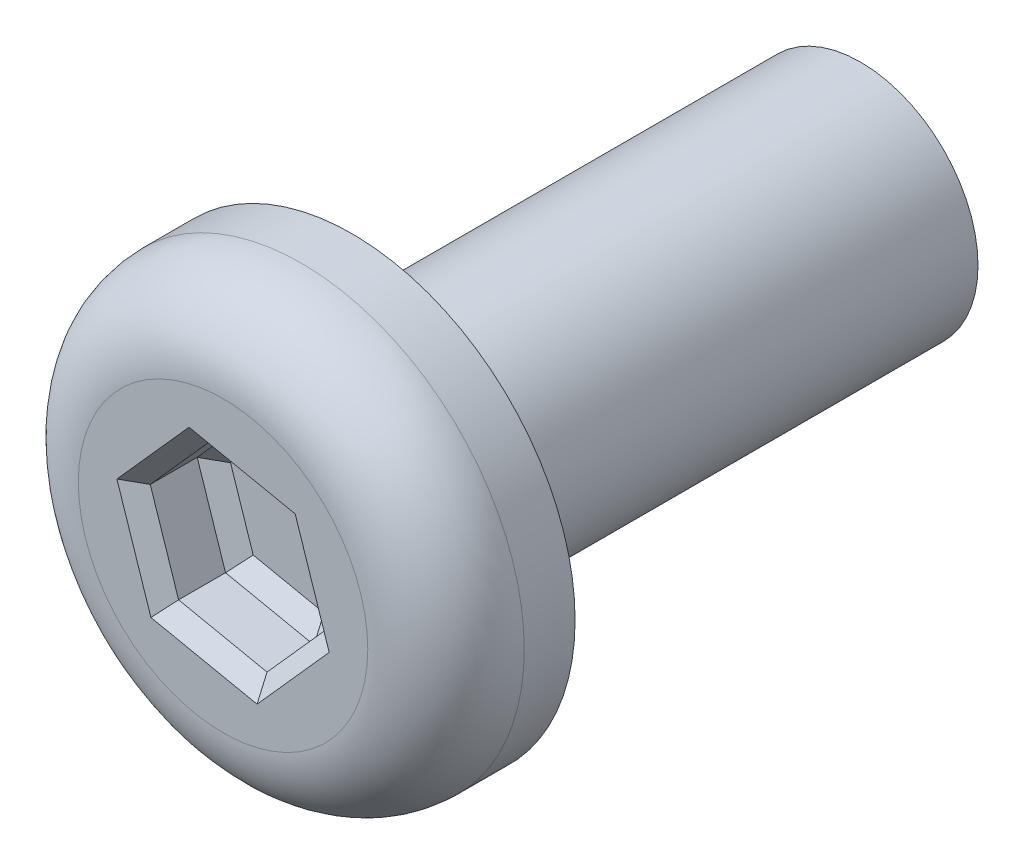
ISO-10303-21;
HEADER;
FILE_DESCRIPTION(('STEP AP214'),'2;1');
FILE_NAME('part.step','',(''),(''),'','','');
FILE_SCHEMA(('AUTOMOTIVE_DESIGN { 1 0 10303 214 1 1 1 1 }'));
ENDSEC;
DATA;
#1=APPLICATION_CONTEXT('core data for automotive mechanical design processes');
#2=APPLICATION_PROTOCOL_DEFINITION('international standard','automotive_design',2000,#1);
#3=PRODUCT_CONTEXT('',#1,'mechanical');
#4=PRODUCT('Part','Part','',(#3));
#5=PRODUCT_RELATED_PRODUCT_CATEGORY('part','',(#4));
#6=PRODUCT_DEFINITION_FORMATION('','',#4);
#7=PRODUCT_DEFINITION_CONTEXT('part definition',#1,'design');
#8=PRODUCT_DEFINITION('design','',#6,#7);
#9=PRODUCT_DEFINITION_SHAPE('','',#8);
#10=(LENGTH_UNIT() NAMED_UNIT(*) SI_UNIT(.MILLI.,.METRE.));
#11=(NAMED_UNIT(*) PLANE_ANGLE_UNIT() SI_UNIT($,.RADIAN.));
#12=(NAMED_UNIT(*) SI_UNIT($,.STERADIAN.) SOLID_ANGLE_UNIT());
#13=UNCERTAINTY_MEASURE_WITH_UNIT(LENGTH_MEASURE(1.E-05),#10,'distance_accuracy_value','');
#14=(GEOMETRIC_REPRESENTATION_CONTEXT(3) GLOBAL_UNCERTAINTY_ASSIGNED_CONTEXT((#13)) GLOBAL_UNIT_ASSIGNED_CONTEXT((#10,
#11,#12)) REPRESENTATION_CONTEXT('',''));
#15=CARTESIAN_POINT('',(0.,0.,0.));
#16=DIRECTION('',(0.,0.,1.));
#17=DIRECTION('',(1.,0.,0.));
#18=AXIS2_PLACEMENT_3D('',#15,#16,#17);
#19=CARTESIAN_POINT('',(0.,0.,1.65));
#20=DIRECTION('',(0.,0.,-1.));
#21=DIRECTION('',(-1.,0.,0.));
#22=AXIS2_PLACEMENT_3D('',#19,#20,#21);
#23=CYLINDRICAL_SURFACE('',#22,2.85);
#24=CARTESIAN_POINT('',(0.,0.,0.65));
#25=DIRECTION('',(0.,0.,1.));
#26=DIRECTION('',(1.,0.,0.));
#27=AXIS2_PLACEMENT_3D('',#24,#25,#26);
#28=CIRCLE('',#27,2.85);
#29=CARTESIAN_POINT('',(2.85,0.,0.65));
#30=VERTEX_POINT('',#29);
#31=EDGE_CURVE('E162',#30,#30,#28,.F.);
#32=ORIENTED_EDGE('',*,*,#31,.T.);
#33=EDGE_LOOP('',(#32));
#34=FACE_BOUND('',#33,.T.);
#35=CARTESIAN_POINT('',(0.,0.,0.));
#36=DIRECTION('',(0.,0.,1.));
#37=DIRECTION('',(1.,0.,0.));
#38=AXIS2_PLACEMENT_3D('',#35,#36,#37);
#39=CIRCLE('',#38,2.85);
#40=CARTESIAN_POINT('',(2.85,0.,0.));
#41=VERTEX_POINT('',#40);
#42=EDGE_CURVE('E255',#41,#41,#39,.T.);
#43=ORIENTED_EDGE('',*,*,#42,.T.);
#44=EDGE_LOOP('',(#43));
#45=FACE_BOUND('',#44,.T.);
#46=ADVANCED_FACE('F36',(#34,#45),#23,.T.);
#47=CARTESIAN_POINT('',(0.,0.,1.65));
#48=DIRECTION('',(0.,0.,1.));
#49=DIRECTION('',(1.,0.,0.));
#50=AXIS2_PLACEMENT_3D('',#47,#48,#49);
#51=PLANE('',#50);
#52=DIRECTION('',(0.313693749060299,-0.949524213382942,0.));
#53=VECTOR('',#52,1.);
#54=CARTESIAN_POINT('',(1.3205402265226,-0.17177556132635,1.65));
#55=LINE('',#54,#53);
#56=CARTESIAN_POINT('',(0.922095651503852,1.03428217111081,1.65));
#57=VERTEX_POINT('',#56);
#58=CARTESIAN_POINT('',(1.35676246061521,-0.281417173366094,1.65));
#59=VERTEX_POINT('',#58);
#60=EDGE_CURVE('E178',#57,#59,#55,.T.);
#61=ORIENTED_EDGE('',*,*,#60,.T.);
#62=DIRECTION('',(-0.665465215767914,-0.74642886238607,0.));
#63=VECTOR('',#62,1.);
#64=CARTESIAN_POINT('',(0.511508113403348,-1.229509163551,1.65));
#65=LINE('',#64,#63);
#66=CARTESIAN_POINT('',(0.43466680911136,-1.31569934447691,1.65));
#67=VERTEX_POINT('',#66);
#68=EDGE_CURVE('E137',#59,#67,#65,.T.);
#69=ORIENTED_EDGE('',*,*,#68,.T.);
#70=DIRECTION('',(-0.979158964828213,0.203095350996872,0.));
#71=VECTOR('',#70,1.);
#72=CARTESIAN_POINT('',(-0.809032113119251,-1.05773360222465,1.65));
#73=LINE('',#72,#71);
#74=CARTESIAN_POINT('',(-0.922095651503853,-1.03428217111081,1.65));
#75=VERTEX_POINT('',#74);
#76=EDGE_CURVE('E164',#67,#75,#73,.T.);
#77=ORIENTED_EDGE('',*,*,#76,.T.);
#78=DIRECTION('',(-0.313693749060299,0.949524213382942,0.));
#79=VECTOR('',#78,1.);
#80=CARTESIAN_POINT('',(-1.3205402265226,0.17177556132635,1.65));
#81=LINE('',#80,#79);
#82=CARTESIAN_POINT('',(-1.35676246061521,0.281417173366094,1.65));
#83=VERTEX_POINT('',#82);
#84=EDGE_CURVE('E172',#75,#83,#81,.T.);
#85=ORIENTED_EDGE('',*,*,#84,.T.);
#86=DIRECTION('',(0.665465215767914,0.74642886238607,0.));
#87=VECTOR('',#86,1.);
#88=CARTESIAN_POINT('',(-0.511508113403349,1.229509163551,1.65));
#89=LINE('',#88,#87);
#90=CARTESIAN_POINT('',(-0.43466680911136,1.31569934447691,1.65));
#91=VERTEX_POINT('',#90);
#92=EDGE_CURVE('E174',#83,#91,#89,.T.);
#93=ORIENTED_EDGE('',*,*,#92,.T.);
#94=DIRECTION('',(0.979158964828213,-0.203095350996872,0.));
#95=VECTOR('',#94,1.);
#96=CARTESIAN_POINT('',(0.80903211311925,1.05773360222465,1.65));
#97=LINE('',#96,#95);
#98=EDGE_CURVE('E176',#91,#57,#97,.T.);
#99=ORIENTED_EDGE('',*,*,#98,.T.);
#100=EDGE_LOOP('',(#61,#69,#77,#85,#93,#99));
#101=FACE_BOUND('',#100,.T.);
#102=CARTESIAN_POINT('',(0.,0.,1.65));
#103=DIRECTION('',(0.,0.,1.));
#104=DIRECTION('',(1.,0.,0.));
#105=AXIS2_PLACEMENT_3D('',#102,#103,#104);
#106=CIRCLE('',#105,1.85);
#107=CARTESIAN_POINT('',(1.85,0.,1.65));
#108=VERTEX_POINT('',#107);
#109=EDGE_CURVE('E167',#108,#108,#106,.T.);
#110=ORIENTED_EDGE('',*,*,#109,.T.);
#111=EDGE_LOOP('',(#110));
#112=FACE_BOUND('',#111,.T.);
#113=ADVANCED_FACE('F263',(#101,#112),#51,.T.);
#114=CARTESIAN_POINT('',(0.,0.,0.));
#115=DIRECTION('',(0.,0.,1.));
#116=DIRECTION('',(1.,0.,0.));
#117=AXIS2_PLACEMENT_3D('',#114,#115,#116);
#118=PLANE('',#117);
#119=CARTESIAN_POINT('',(0.,0.,0.));
#120=DIRECTION('',(0.,0.,-1.));
#121=DIRECTION('',(-1.,0.,0.));
#122=AXIS2_PLACEMENT_3D('',#119,#120,#121);
#123=CIRCLE('',#122,1.5);
#124=CARTESIAN_POINT('',(1.5,0.,0.));
#125=VERTEX_POINT('',#124);
#126=EDGE_CURVE('E256',#125,#125,#123,.T.);
#127=ORIENTED_EDGE('',*,*,#126,.F.);
#128=EDGE_LOOP('',(#127));
#129=FACE_BOUND('',#128,.T.);
#130=ORIENTED_EDGE('',*,*,#42,.F.);
#131=EDGE_LOOP('',(#130));
#132=FACE_BOUND('',#131,.T.);
#133=ADVANCED_FACE('F289',(#129,#132),#118,.F.);
#134=CARTESIAN_POINT('',(0.,0.,-6.5));
#135=DIRECTION('',(0.,0.,1.));
#136=DIRECTION('',(1.,0.,0.));
#137=AXIS2_PLACEMENT_3D('',#134,#135,#136);
#138=CYLINDRICAL_SURFACE('',#137,1.5);
#139=CARTESIAN_POINT('',(0.,0.,-6.5));
#140=DIRECTION('',(0.,0.,-1.));
#141=DIRECTION('',(-1.,0.,0.));
#142=AXIS2_PLACEMENT_3D('',#139,#140,#141);
#143=CIRCLE('',#142,1.5);
#144=CARTESIAN_POINT('',(1.5,0.,-6.5));
#145=VERTEX_POINT('',#144);
#146=EDGE_CURVE('E252',#145,#145,#143,.T.);
#147=CARTESIAN_POINT('',(1.5,0.,-6.5));
#148=CARTESIAN_POINT('',(1.5,0.,-6.43229166666667));
#149=CARTESIAN_POINT('',(1.5,0.,-6.36458333333333));
#150=CARTESIAN_POINT('',(1.5,0.,-6.22916666666667));
#151=CARTESIAN_POINT('',(1.5,0.,-6.16145833333333));
#152=CARTESIAN_POINT('',(1.5,0.,-6.02604166666667));
#153=CARTESIAN_POINT('',(1.5,0.,-5.95833333333333));
#154=CARTESIAN_POINT('',(1.5,0.,-5.82291666666667));
#155=CARTESIAN_POINT('',(1.5,0.,-5.75520833333333));
#156=CARTESIAN_POINT('',(1.5,0.,-5.61979166666667));
#157=CARTESIAN_POINT('',(1.5,0.,-5.55208333333333));
#158=CARTESIAN_POINT('',(1.5,0.,-5.41666666666667));
#159=CARTESIAN_POINT('',(1.5,0.,-5.34895833333333));
#160=CARTESIAN_POINT('',(1.5,0.,-5.21354166666667));
#161=CARTESIAN_POINT('',(1.5,0.,-5.14583333333333));
#162=CARTESIAN_POINT('',(1.5,0.,-5.01041666666667));
#163=CARTESIAN_POINT('',(1.5,0.,-4.94270833333333));
#164=CARTESIAN_POINT('',(1.5,0.,-4.80729166666667));
#165=CARTESIAN_POINT('',(1.5,0.,-4.73958333333333));
#166=CARTESIAN_POINT('',(1.5,0.,-4.60416666666667));
#167=CARTESIAN_POINT('',(1.5,0.,-4.53645833333333));
#168=CARTESIAN_POINT('',(1.5,0.,-4.40104166666667));
#169=CARTESIAN_POINT('',(1.5,0.,-4.33333333333333));
#170=CARTESIAN_POINT('',(1.5,0.,-4.19791666666667));
#171=CARTESIAN_POINT('',(1.5,0.,-4.13020833333333));
#172=CARTESIAN_POINT('',(1.5,0.,-3.99479166666667));
#173=CARTESIAN_POINT('',(1.5,0.,-3.92708333333333));
#174=CARTESIAN_POINT('',(1.5,0.,-3.79166666666667));
#175=CARTESIAN_POINT('',(1.5,0.,-3.72395833333333));
#176=CARTESIAN_POINT('',(1.5,0.,-3.58854166666667));
#177=CARTESIAN_POINT('',(1.5,0.,-3.52083333333333));
#178=CARTESIAN_POINT('',(1.5,0.,-3.38541666666667));
#179=CARTESIAN_POINT('',(1.5,0.,-3.31770833333333));
#180=CARTESIAN_POINT('',(1.5,0.,-3.18229166666667));
#181=CARTESIAN_POINT('',(1.5,0.,-3.11458333333333));
#182=CARTESIAN_POINT('',(1.5,0.,-2.97916666666667));
#183=CARTESIAN_POINT('',(1.5,0.,-2.91145833333333));
#184=CARTESIAN_POINT('',(1.5,0.,-2.77604166666667));
#185=CARTESIAN_POINT('',(1.5,0.,-2.70833333333333));
#186=CARTESIAN_POINT('',(1.5,0.,-2.57291666666667));
#187=CARTESIAN_POINT('',(1.5,0.,-2.50520833333333));
#188=CARTESIAN_POINT('',(1.5,0.,-2.36979166666667));
#189=CARTESIAN_POINT('',(1.5,0.,-2.30208333333333));
#190=CARTESIAN_POINT('',(1.5,0.,-2.16666666666667));
#191=CARTESIAN_POINT('',(1.5,0.,-2.09895833333333));
#192=CARTESIAN_POINT('',(1.5,0.,-1.96354166666667));
#193=CARTESIAN_POINT('',(1.5,0.,-1.89583333333333));
#194=CARTESIAN_POINT('',(1.5,0.,-1.76041666666667));
#195=CARTESIAN_POINT('',(1.5,0.,-1.69270833333333));
#196=CARTESIAN_POINT('',(1.5,0.,-1.55729166666667));
#197=CARTESIAN_POINT('',(1.5,0.,-1.48958333333333));
#198=CARTESIAN_POINT('',(1.5,0.,-1.35416666666667));
#199=CARTESIAN_POINT('',(1.5,0.,-1.28645833333333));
#200=CARTESIAN_POINT('',(1.5,0.,-1.15104166666667));
#201=CARTESIAN_POINT('',(1.5,0.,-1.08333333333333));
#202=CARTESIAN_POINT('',(1.5,0.,-0.947916666666667));
#203=CARTESIAN_POINT('',(1.5,0.,-0.880208333333333));
#204=CARTESIAN_POINT('',(1.5,0.,-0.744791666666667));
#205=CARTESIAN_POINT('',(1.5,0.,-0.677083333333333));
#206=CARTESIAN_POINT('',(1.5,0.,-0.541666666666667));
#207=CARTESIAN_POINT('',(1.5,0.,-0.473958333333333));
#208=CARTESIAN_POINT('',(1.5,0.,-0.338541666666667));
#209=CARTESIAN_POINT('',(1.5,0.,-0.270833333333334));
#210=CARTESIAN_POINT('',(1.5,0.,-0.135416666666667));
#211=CARTESIAN_POINT('',(1.5,0.,-0.0677083333333334));
#212=CARTESIAN_POINT('',(1.5,0.,0.));
#213=B_SPLINE_CURVE_WITH_KNOTS('',3,(#147,#148,#149,#150,#151,#152,#153,#154,#155,#156,#157,
#158,#159,#160,#161,#162,#163,#164,#165,#166,#167,#168,#169,#170,#171,#172,#173,#174,#175,#176,
#177,#178,#179,#180,#181,#182,#183,#184,#185,#186,#187,#188,#189,#190,#191,#192,#193,#194,#195,
#196,#197,#198,#199,#200,#201,#202,#203,#204,#205,#206,#207,#208,#209,#210,#211,#212),
.UNSPECIFIED.,.F.,.F.,(4,2,2,2,2,2,2,2,2,2,2,2,2,2,2,2,2,2,2,2,2,2,2,2,2,2,2,2,2,2,2,2,4),(0.,
0.203124999999999,0.40625,0.609375,0.812499999999999,1.015625,1.21875,1.421875,1.625,1.828125,
2.03125,2.234375,2.4375,2.640625,2.84375,3.046875,3.25,3.453125,3.65625,3.859375,4.0625,
4.265625,4.46875,4.671875,4.875,5.078125,5.28125,5.484375,5.6875,5.890625,6.09375,6.296875,6.5),.UNSPECIFIED.);
#214=EDGE_CURVE('BSEAM278',#145,#125,#213,.T.);
#215=ORIENTED_EDGE('',*,*,#146,.F.);
#216=ORIENTED_EDGE('',*,*,#126,.T.);
#217=ORIENTED_EDGE('',*,*,#214,.T.);
#218=ORIENTED_EDGE('',*,*,#214,.F.);
#219=EDGE_LOOP('',(#215,#217,#216,#218));
#220=FACE_BOUND('',#219,.T.);
#221=ADVANCED_FACE('F278',(#220),#138,.T.);
#222=CARTESIAN_POINT('',(0.,0.,-6.5));
#223=DIRECTION('',(0.,0.,-1.));
#224=DIRECTION('',(-1.,0.,0.));
#225=AXIS2_PLACEMENT_3D('',#222,#223,#224);
#226=PLANE('',#225);
#227=ORIENTED_EDGE('',*,*,#146,.T.);
#228=EDGE_LOOP('',(#227));
#229=FACE_BOUND('',#228,.T.);
#230=ADVANCED_FACE('F268',(#229),#226,.T.);
#231=CARTESIAN_POINT('',(0.,0.,0.65));
#232=DIRECTION('',(0.,0.,1.));
#233=DIRECTION('',(1.,0.,0.));
#234=AXIS2_PLACEMENT_3D('',#231,#232,#233);
#235=TOROIDAL_SURFACE('',#234,1.85,1.);
#236=ORIENTED_EDGE('',*,*,#31,.F.);
#237=EDGE_LOOP('',(#236));
#238=FACE_BOUND('',#237,.T.);
#239=ORIENTED_EDGE('',*,*,#109,.F.);
#240=EDGE_LOOP('',(#239));
#241=FACE_BOUND('',#240,.T.);
#242=ADVANCED_FACE('F265',(#238,#241),#235,.T.);
#243=CARTESIAN_POINT('',(-0.768413042919876,-0.861901809259008,0.65));
#244=DIRECTION('',(-0.203095350996872,-0.979158964828213,0.));
#245=DIRECTION('',(0.979158964828213,-0.203095350996872,0.));
#246=AXIS2_PLACEMENT_3D('',#243,#244,#245);
#247=PLANE('',#246);
#248=DIRECTION('',(0.,0.,1.));
#249=VECTOR('',#248,1.);
#250=CARTESIAN_POINT('',(-0.768413042919876,-0.861901809259008,0.65));
#251=LINE('',#250,#249);
#252=CARTESIAN_POINT('',(-0.768413042919876,-0.861901809259008,0.849999999999997));
#253=VERTEX_POINT('',#252);
#254=CARTESIAN_POINT('',(-0.768413042919876,-0.861901809259008,1.45));
#255=VERTEX_POINT('',#254);
#256=EDGE_CURVE('E246',#253,#255,#251,.T.);
#257=ORIENTED_EDGE('',*,*,#256,.T.);
#258=DIRECTION('',(0.979158964828213,-0.203095350996872,0.));
#259=VECTOR('',#258,1.);
#260=CARTESIAN_POINT('',(0.362222340926133,-1.09641612039742,1.45));
#261=LINE('',#260,#259);
#262=CARTESIAN_POINT('',(0.362222340926132,-1.09641612039742,1.45));
#263=VERTEX_POINT('',#262);
#264=EDGE_CURVE('E198',#255,#263,#261,.T.);
#265=ORIENTED_EDGE('',*,*,#264,.T.);
#266=DIRECTION('',(0.,0.,1.));
#267=VECTOR('',#266,1.);
#268=CARTESIAN_POINT('',(0.362222340926132,-1.09641612039742,0.65));
#269=LINE('',#268,#267);
#270=CARTESIAN_POINT('',(0.362222340926132,-1.09641612039742,0.849999999999997));
#271=VERTEX_POINT('',#270);
#272=EDGE_CURVE('E148',#271,#263,#269,.T.);
#273=ORIENTED_EDGE('',*,*,#272,.F.);
#274=DIRECTION('',(-0.979158964828213,0.203095350996872,0.));
#275=VECTOR('',#274,1.);
#276=CARTESIAN_POINT('',(-0.768413042919876,-0.861901809259008,0.849999999999997));
#277=LINE('',#276,#275);
#278=EDGE_CURVE('E196',#271,#253,#277,.T.);
#279=ORIENTED_EDGE('',*,*,#278,.T.);
#280=EDGE_LOOP('',(#257,#265,#273,#279));
#281=FACE_BOUND('',#280,.T.);
#282=ADVANCED_FACE('F267',(#281),#247,.F.);
#283=CARTESIAN_POINT('',(-1.13063538384601,0.234514311138411,0.65));
#284=DIRECTION('',(-0.949524213382942,-0.313693749060299,0.));
#285=DIRECTION('',(0.313693749060299,-0.949524213382942,0.));
#286=AXIS2_PLACEMENT_3D('',#283,#284,#285);
#287=PLANE('',#286);
#288=DIRECTION('',(0.,0.,1.));
#289=VECTOR('',#288,1.);
#290=CARTESIAN_POINT('',(-1.13063538384601,0.234514311138411,0.65));
#291=LINE('',#290,#289);
#292=CARTESIAN_POINT('',(-1.13063538384601,0.234514311138411,0.849999999999997));
#293=VERTEX_POINT('',#292);
#294=CARTESIAN_POINT('',(-1.13063538384601,0.234514311138411,1.45));
#295=VERTEX_POINT('',#294);
#296=EDGE_CURVE('E243',#293,#295,#291,.T.);
#297=ORIENTED_EDGE('',*,*,#296,.T.);
#298=DIRECTION('',(0.313693749060299,-0.949524213382942,0.));
#299=VECTOR('',#298,1.);
#300=CARTESIAN_POINT('',(-0.768413042919876,-0.861901809259008,1.45));
#301=LINE('',#300,#299);
#302=EDGE_CURVE('E194',#295,#255,#301,.T.);
#303=ORIENTED_EDGE('',*,*,#302,.T.);
#304=ORIENTED_EDGE('',*,*,#256,.F.);
#305=DIRECTION('',(-0.313693749060299,0.949524213382942,0.));
#306=VECTOR('',#305,1.);
#307=CARTESIAN_POINT('',(-1.13063538384601,0.234514311138411,0.849999999999997));
#308=LINE('',#307,#306);
#309=EDGE_CURVE('E191',#253,#293,#308,.T.);
#310=ORIENTED_EDGE('',*,*,#309,.T.);
#311=EDGE_LOOP('',(#297,#303,#304,#310));
#312=FACE_BOUND('',#311,.T.);
#313=ADVANCED_FACE('F275',(#312),#287,.F.);
#314=CARTESIAN_POINT('',(-0.362222340926133,1.09641612039742,0.65));
#315=DIRECTION('',(-0.74642886238607,0.665465215767914,0.));
#316=DIRECTION('',(-0.665465215767914,-0.74642886238607,0.));
#317=AXIS2_PLACEMENT_3D('',#314,#315,#316);
#318=PLANE('',#317);
#319=DIRECTION('',(0.,0.,1.));
#320=VECTOR('',#319,1.);
#321=CARTESIAN_POINT('',(-0.362222340926133,1.09641612039742,0.65));
#322=LINE('',#321,#320);
#323=CARTESIAN_POINT('',(-0.362222340926133,1.09641612039742,0.849999999999997));
#324=VERTEX_POINT('',#323);
#325=CARTESIAN_POINT('',(-0.362222340926133,1.09641612039742,1.45));
#326=VERTEX_POINT('',#325);
#327=EDGE_CURVE('E240',#324,#326,#322,.T.);
#328=ORIENTED_EDGE('',*,*,#327,.T.);
#329=DIRECTION('',(-0.665465215767914,-0.74642886238607,0.));
#330=VECTOR('',#329,1.);
#331=CARTESIAN_POINT('',(-1.13063538384601,0.234514311138411,1.45));
#332=LINE('',#331,#330);
#333=EDGE_CURVE('E189',#326,#295,#332,.T.);
#334=ORIENTED_EDGE('',*,*,#333,.T.);
#335=ORIENTED_EDGE('',*,*,#296,.F.);
#336=DIRECTION('',(0.665465215767914,0.74642886238607,0.));
#337=VECTOR('',#336,1.);
#338=CARTESIAN_POINT('',(-0.362222340926133,1.09641612039742,0.849999999999997));
#339=LINE('',#338,#337);
#340=EDGE_CURVE('E187',#293,#324,#339,.T.);
#341=ORIENTED_EDGE('',*,*,#340,.T.);
#342=EDGE_LOOP('',(#328,#334,#335,#341));
#343=FACE_BOUND('',#342,.T.);
#344=ADVANCED_FACE('F307',(#343),#318,.F.);
#345=CARTESIAN_POINT('',(0.768413042919875,0.861901809259008,0.65));
#346=DIRECTION('',(0.203095350996872,0.979158964828213,0.));
#347=DIRECTION('',(-0.979158964828213,0.203095350996872,0.));
#348=AXIS2_PLACEMENT_3D('',#345,#346,#347);
#349=PLANE('',#348);
#350=DIRECTION('',(0.,0.,1.));
#351=VECTOR('',#350,1.);
#352=CARTESIAN_POINT('',(0.768413042919875,0.861901809259008,0.65));
#353=LINE('',#352,#351);
#354=CARTESIAN_POINT('',(0.768413042919875,0.861901809259008,0.849999999999997));
#355=VERTEX_POINT('',#354);
#356=CARTESIAN_POINT('',(0.768413042919875,0.861901809259008,1.45));
#357=VERTEX_POINT('',#356);
#358=EDGE_CURVE('E131',#355,#357,#353,.T.);
#359=ORIENTED_EDGE('',*,*,#358,.T.);
#360=DIRECTION('',(-0.979158964828213,0.203095350996872,0.));
#361=VECTOR('',#360,1.);
#362=CARTESIAN_POINT('',(-0.362222340926133,1.09641612039742,1.45));
#363=LINE('',#362,#361);
#364=EDGE_CURVE('E185',#357,#326,#363,.T.);
#365=ORIENTED_EDGE('',*,*,#364,.T.);
#366=ORIENTED_EDGE('',*,*,#327,.F.);
#367=DIRECTION('',(0.979158964828213,-0.203095350996872,0.));
#368=VECTOR('',#367,1.);
#369=CARTESIAN_POINT('',(0.768413042919875,0.861901809259008,0.849999999999997));
#370=LINE('',#369,#368);
#371=EDGE_CURVE('E183',#324,#355,#370,.T.);
#372=ORIENTED_EDGE('',*,*,#371,.T.);
#373=EDGE_LOOP('',(#359,#365,#366,#372));
#374=FACE_BOUND('',#373,.T.);
#375=ADVANCED_FACE('F237',(#374),#349,.F.);
#376=CARTESIAN_POINT('',(1.13063538384601,-0.234514311138411,0.65));
#377=DIRECTION('',(0.949524213382942,0.313693749060299,0.));
#378=DIRECTION('',(-0.313693749060299,0.949524213382942,0.));
#379=AXIS2_PLACEMENT_3D('',#376,#377,#378);
#380=PLANE('',#379);
#381=DIRECTION('',(0.,0.,1.));
#382=VECTOR('',#381,1.);
#383=CARTESIAN_POINT('',(1.13063538384601,-0.234514311138411,0.65));
#384=LINE('',#383,#382);
#385=CARTESIAN_POINT('',(1.13063538384601,-0.234514311138411,0.849999999999997));
#386=VERTEX_POINT('',#385);
#387=CARTESIAN_POINT('',(1.13063538384601,-0.234514311138411,1.45));
#388=VERTEX_POINT('',#387);
#389=EDGE_CURVE('E129',#386,#388,#384,.T.);
#390=ORIENTED_EDGE('',*,*,#389,.T.);
#391=DIRECTION('',(-0.313693749060299,0.949524213382942,0.));
#392=VECTOR('',#391,1.);
#393=CARTESIAN_POINT('',(0.768413042919875,0.861901809259008,1.45));
#394=LINE('',#393,#392);
#395=EDGE_CURVE('E136',#388,#357,#394,.T.);
#396=ORIENTED_EDGE('',*,*,#395,.T.);
#397=ORIENTED_EDGE('',*,*,#358,.F.);
#398=DIRECTION('',(0.313693749060299,-0.949524213382942,0.));
#399=VECTOR('',#398,1.);
#400=CARTESIAN_POINT('',(1.13063538384601,-0.234514311138411,0.849999999999997));
#401=LINE('',#400,#399);
#402=EDGE_CURVE('E126',#355,#386,#401,.T.);
#403=ORIENTED_EDGE('',*,*,#402,.T.);
#404=EDGE_LOOP('',(#390,#396,#397,#403));
#405=FACE_BOUND('',#404,.T.);
#406=ADVANCED_FACE('F128',(#405),#380,.F.);
#407=CARTESIAN_POINT('',(0.362222340926132,-1.09641612039742,0.65));
#408=DIRECTION('',(0.74642886238607,-0.665465215767914,0.));
#409=DIRECTION('',(0.665465215767914,0.74642886238607,0.));
#410=AXIS2_PLACEMENT_3D('',#407,#408,#409);
#411=PLANE('',#410);
#412=ORIENTED_EDGE('',*,*,#272,.T.);
#413=DIRECTION('',(0.665465215767914,0.74642886238607,0.));
#414=VECTOR('',#413,1.);
#415=CARTESIAN_POINT('',(1.13063538384601,-0.234514311138411,1.45));
#416=LINE('',#415,#414);
#417=EDGE_CURVE('E147',#263,#388,#416,.T.);
#418=ORIENTED_EDGE('',*,*,#417,.T.);
#419=ORIENTED_EDGE('',*,*,#389,.F.);
#420=DIRECTION('',(-0.665465215767914,-0.74642886238607,0.));
#421=VECTOR('',#420,1.);
#422=CARTESIAN_POINT('',(0.362222340926132,-1.09641612039742,0.849999999999997));
#423=LINE('',#422,#421);
#424=EDGE_CURVE('E144',#386,#271,#423,.T.);
#425=ORIENTED_EDGE('',*,*,#424,.T.);
#426=EDGE_LOOP('',(#412,#418,#419,#425));
#427=FACE_BOUND('',#426,.T.);
#428=ADVANCED_FACE('F142',(#427),#411,.F.);
#429=CARTESIAN_POINT('',(0.,0.,0.65));
#430=DIRECTION('',(0.,0.,1.));
#431=DIRECTION('',(1.,0.,0.));
#432=AXIS2_PLACEMENT_3D('',#429,#430,#431);
#433=PLANE('',#432);
#434=DIRECTION('',(-0.665465215767914,-0.74642886238607,0.));
#435=VECTOR('',#434,1.);
#436=CARTESIAN_POINT('',(-0.597143089908858,0.532372172614333,0.65));
#437=LINE('',#436,#435);
#438=CARTESIAN_POINT('',(-0.289777872740907,0.877132896317936,0.65));
#439=VERTEX_POINT('',#438);
#440=CARTESIAN_POINT('',(-0.904508307076808,0.187611448910729,0.65));
#441=VERTEX_POINT('',#440);
#442=EDGE_CURVE('E45',#439,#441,#437,.T.);
#443=ORIENTED_EDGE('',*,*,#442,.T.);
#444=DIRECTION('',(0.313693749060299,-0.949524213382942,0.));
#445=VECTOR('',#444,1.);
#446=CARTESIAN_POINT('',(-0.759619370706354,-0.250954999248239,0.65));
#447=LINE('',#446,#445);
#448=CARTESIAN_POINT('',(-0.614730434335901,-0.689521447407207,0.65));
#449=VERTEX_POINT('',#448);
#450=EDGE_CURVE('E11',#441,#449,#447,.T.);
#451=ORIENTED_EDGE('',*,*,#450,.T.);
#452=DIRECTION('',(0.979158964828213,-0.203095350996872,0.));
#453=VECTOR('',#452,1.);
#454=CARTESIAN_POINT('',(-0.162476280797498,-0.783327171862572,0.65));
#455=LINE('',#454,#453);
#456=CARTESIAN_POINT('',(0.289777872740906,-0.877132896317936,0.65));
#457=VERTEX_POINT('',#456);
#458=EDGE_CURVE('E200',#449,#457,#455,.T.);
#459=ORIENTED_EDGE('',*,*,#458,.T.);
#460=DIRECTION('',(0.665465215767914,0.74642886238607,0.));
#461=VECTOR('',#460,1.);
#462=CARTESIAN_POINT('',(0.597143089908857,-0.532372172614332,0.65));
#463=LINE('',#462,#461);
#464=CARTESIAN_POINT('',(0.904508307076807,-0.187611448910729,0.65));
#465=VERTEX_POINT('',#464);
#466=EDGE_CURVE('E202',#457,#465,#463,.T.);
#467=ORIENTED_EDGE('',*,*,#466,.T.);
#468=DIRECTION('',(-0.313693749060299,0.949524213382942,0.));
#469=VECTOR('',#468,1.);
#470=CARTESIAN_POINT('',(0.759619370706354,0.250954999248239,0.65));
#471=LINE('',#470,#469);
#472=CARTESIAN_POINT('',(0.614730434335901,0.689521447407208,0.65));
#473=VERTEX_POINT('',#472);
#474=EDGE_CURVE('E153',#465,#473,#471,.T.);
#475=ORIENTED_EDGE('',*,*,#474,.T.);
#476=DIRECTION('',(-0.979158964828213,0.203095350996872,0.));
#477=VECTOR('',#476,1.);
#478=CARTESIAN_POINT('',(0.162476280797498,0.783327171862572,0.65));
#479=LINE('',#478,#477);
#480=EDGE_CURVE('E56',#473,#439,#479,.T.);
#481=ORIENTED_EDGE('',*,*,#480,.T.);
#482=EDGE_LOOP('',(#443,#451,#459,#467,#475,#481));
#483=FACE_BOUND('',#482,.T.);
#484=ADVANCED_FACE('F302',(#483),#433,.T.);
#485=CARTESIAN_POINT('',(-0.362222340926133,1.09641612039742,1.45));
#486=DIRECTION('',(0.527804910266548,-0.470554966713259,0.707106781186551));
#487=DIRECTION('',(0.665465215767914,0.74642886238607,0.));
#488=AXIS2_PLACEMENT_3D('',#485,#486,#487);
#489=PLANE('',#488);
#490=DIRECTION('',(-0.237130185099731,0.717772837841572,0.654653670707973));
#491=VECTOR('',#490,1.);
#492=CARTESIAN_POINT('',(-0.258730243518665,0.783154371712439,1.16428571428571));
#493=LINE('',#492,#491);
#494=EDGE_CURVE('E217',#91,#326,#493,.F.);
#495=ORIENTED_EDGE('',*,*,#494,.F.);
#496=ORIENTED_EDGE('',*,*,#92,.F.);
#497=DIRECTION('',(-0.740174604267115,0.153525654620315,0.654653670707974));
#498=VECTOR('',#497,1.);
#499=CARTESIAN_POINT('',(-0.807596702747147,0.167510222241721,1.16428571428572));
#500=LINE('',#499,#498);
#501=EDGE_CURVE('E220',#295,#83,#500,.T.);
#502=ORIENTED_EDGE('',*,*,#501,.F.);
#503=ORIENTED_EDGE('',*,*,#333,.F.);
#504=EDGE_LOOP('',(#495,#496,#502,#503));
#505=FACE_BOUND('',#504,.T.);
#506=ADVANCED_FACE('F314',(#505),#489,.T.);
#507=CARTESIAN_POINT('',(-1.13063538384601,0.234514311138411,1.45));
#508=DIRECTION('',(0.671415010183898,0.221814977176367,0.707106781186551));
#509=DIRECTION('',(-0.313693749060299,0.949524213382942,0.));
#510=AXIS2_PLACEMENT_3D('',#507,#508,#509);
#511=PLANE('',#510);
#512=ORIENTED_EDGE('',*,*,#501,.T.);
#513=ORIENTED_EDGE('',*,*,#84,.F.);
#514=DIRECTION('',(-0.503044419167384,-0.564247183221259,0.654653670707974));
#515=VECTOR('',#514,1.);
#516=CARTESIAN_POINT('',(-0.548866459228481,-0.615644149470717,1.16428571428571));
#517=LINE('',#516,#515);
#518=EDGE_CURVE('E214',#255,#75,#517,.T.);
#519=ORIENTED_EDGE('',*,*,#518,.F.);
#520=ORIENTED_EDGE('',*,*,#302,.F.);
#521=EDGE_LOOP('',(#512,#513,#519,#520));
#522=FACE_BOUND('',#521,.T.);
#523=ADVANCED_FACE('F318',(#522),#511,.T.);
#524=CARTESIAN_POINT('',(0.768413042919875,0.861901809259008,1.45));
#525=DIRECTION('',(-0.143610099917349,-0.692369943889626,0.707106781186551));
#526=DIRECTION('',(0.979158964828213,-0.203095350996872,0.));
#527=AXIS2_PLACEMENT_3D('',#524,#525,#526);
#528=PLANE('',#527);
#529=ORIENTED_EDGE('',*,*,#494,.T.);
#530=ORIENTED_EDGE('',*,*,#364,.F.);
#531=DIRECTION('',(0.503044419167385,0.564247183221259,0.654653670707974));
#532=VECTOR('',#531,1.);
#533=CARTESIAN_POINT('',(0.54886645922848,0.615644149470718,1.16428571428571));
#534=LINE('',#533,#532);
#535=EDGE_CURVE('E211',#57,#357,#534,.F.);
#536=ORIENTED_EDGE('',*,*,#535,.F.);
#537=ORIENTED_EDGE('',*,*,#98,.F.);
#538=EDGE_LOOP('',(#529,#530,#536,#537));
#539=FACE_BOUND('',#538,.T.);
#540=ADVANCED_FACE('F324',(#539),#528,.T.);
#541=CARTESIAN_POINT('',(-0.768413042919876,-0.861901809259008,1.45));
#542=DIRECTION('',(0.14361009991735,0.692369943889626,0.707106781186551));
#543=DIRECTION('',(-0.979158964828213,0.203095350996872,0.));
#544=AXIS2_PLACEMENT_3D('',#541,#542,#543);
#545=PLANE('',#544);
#546=ORIENTED_EDGE('',*,*,#518,.T.);
#547=ORIENTED_EDGE('',*,*,#76,.F.);
#548=DIRECTION('',(-0.23713018509973,0.717772837841573,-0.654653670707973));
#549=VECTOR('',#548,1.);
#550=CARTESIAN_POINT('',(0.362222340926132,-1.09641612039742,1.45));
#551=LINE('',#550,#549);
#552=EDGE_CURVE('E209',#263,#67,#551,.F.);
#553=ORIENTED_EDGE('',*,*,#552,.F.);
#554=ORIENTED_EDGE('',*,*,#264,.F.);
#555=EDGE_LOOP('',(#546,#547,#553,#554));
#556=FACE_BOUND('',#555,.T.);
#557=ADVANCED_FACE('F354',(#556),#545,.T.);
#558=CARTESIAN_POINT('',(1.13063538384601,-0.234514311138411,1.45));
#559=DIRECTION('',(-0.671415010183897,-0.221814977176367,0.707106781186551));
#560=DIRECTION('',(0.313693749060299,-0.949524213382942,0.));
#561=AXIS2_PLACEMENT_3D('',#558,#559,#560);
#562=PLANE('',#561);
#563=ORIENTED_EDGE('',*,*,#535,.T.);
#564=ORIENTED_EDGE('',*,*,#395,.F.);
#565=DIRECTION('',(0.740174604267115,-0.153525654620315,0.654653670707973));
#566=VECTOR('',#565,1.);
#567=CARTESIAN_POINT('',(0.807596702747147,-0.167510222241721,1.16428571428572));
#568=LINE('',#567,#566);
#569=EDGE_CURVE('E207',#59,#388,#568,.F.);
#570=ORIENTED_EDGE('',*,*,#569,.F.);
#571=ORIENTED_EDGE('',*,*,#60,.F.);
#572=EDGE_LOOP('',(#563,#564,#570,#571));
#573=FACE_BOUND('',#572,.T.);
#574=ADVANCED_FACE('F349',(#573),#562,.T.);
#575=CARTESIAN_POINT('',(0.362222340926132,-1.09641612039742,1.45));
#576=DIRECTION('',(-0.527804910266548,0.470554966713259,0.707106781186551));
#577=DIRECTION('',(-0.665465215767914,-0.74642886238607,0.));
#578=AXIS2_PLACEMENT_3D('',#575,#576,#577);
#579=PLANE('',#578);
#580=ORIENTED_EDGE('',*,*,#552,.T.);
#581=ORIENTED_EDGE('',*,*,#68,.F.);
#582=ORIENTED_EDGE('',*,*,#569,.T.);
#583=ORIENTED_EDGE('',*,*,#417,.F.);
#584=EDGE_LOOP('',(#580,#581,#582,#583));
#585=FACE_BOUND('',#584,.T.);
#586=ADVANCED_FACE('F345',(#585),#579,.T.);
#587=CARTESIAN_POINT('',(0.759619370706354,0.250954999248239,0.65));
#588=DIRECTION('',(0.671415010183897,0.221814977176367,-0.707106781186551));
#589=DIRECTION('',(-0.313693749060299,0.949524213382942,0.));
#590=AXIS2_PLACEMENT_3D('',#587,#588,#589);
#591=PLANE('',#590);
#592=DIRECTION('',(-0.740174604267115,0.153525654620312,-0.654653670707973));
#593=VECTOR('',#592,1.);
#594=CARTESIAN_POINT('',(0.775292834637263,-0.160809813352054,0.535714285714286));
#595=LINE('',#594,#593);
#596=EDGE_CURVE('E152',#386,#465,#595,.T.);
#597=ORIENTED_EDGE('',*,*,#596,.F.);
#598=ORIENTED_EDGE('',*,*,#402,.F.);
#599=DIRECTION('',(-0.503044419167386,-0.564247183221258,-0.654653670707973));
#600=VECTOR('',#599,1.);
#601=CARTESIAN_POINT('',(0.526911800859343,0.591018383491892,0.535714285714286));
#602=LINE('',#601,#600);
#603=EDGE_CURVE('E40',#473,#355,#602,.F.);
#604=ORIENTED_EDGE('',*,*,#603,.F.);
#605=ORIENTED_EDGE('',*,*,#474,.F.);
#606=EDGE_LOOP('',(#597,#598,#604,#605));
#607=FACE_BOUND('',#606,.T.);
#608=ADVANCED_FACE('F38',(#607),#591,.F.);
#609=CARTESIAN_POINT('',(0.162476280797498,0.783327171862572,0.65));
#610=DIRECTION('',(0.143610099917349,0.692369943889626,-0.707106781186551));
#611=DIRECTION('',(-0.979158964828213,0.203095350996872,0.));
#612=AXIS2_PLACEMENT_3D('',#609,#610,#611);
#613=PLANE('',#612);
#614=ORIENTED_EDGE('',*,*,#603,.T.);
#615=ORIENTED_EDGE('',*,*,#371,.F.);
#616=DIRECTION('',(0.237130185099729,-0.717772837841572,-0.654653670707974));
#617=VECTOR('',#616,1.);
#618=CARTESIAN_POINT('',(-0.24838103377792,0.751828196843944,0.535714285714285));
#619=LINE('',#618,#617);
#620=EDGE_CURVE('E156',#439,#324,#619,.F.);
#621=ORIENTED_EDGE('',*,*,#620,.F.);
#622=ORIENTED_EDGE('',*,*,#480,.F.);
#623=EDGE_LOOP('',(#614,#615,#621,#622));
#624=FACE_BOUND('',#623,.T.);
#625=ADVANCED_FACE('F234',(#624),#613,.F.);
#626=CARTESIAN_POINT('',(0.597143089908857,-0.532372172614332,0.65));
#627=DIRECTION('',(0.527804910266548,-0.470554966713259,-0.707106781186551));
#628=DIRECTION('',(0.665465215767914,0.74642886238607,0.));
#629=AXIS2_PLACEMENT_3D('',#626,#627,#628);
#630=PLANE('',#629);
#631=ORIENTED_EDGE('',*,*,#596,.T.);
#632=ORIENTED_EDGE('',*,*,#466,.F.);
#633=DIRECTION('',(-0.237130185099729,0.717772837841572,-0.654653670707974));
#634=VECTOR('',#633,1.);
#635=CARTESIAN_POINT('',(0.248381033777919,-0.751828196843944,0.535714285714285));
#636=LINE('',#635,#634);
#637=EDGE_CURVE('E160',#271,#457,#636,.T.);
#638=ORIENTED_EDGE('',*,*,#637,.F.);
#639=ORIENTED_EDGE('',*,*,#424,.F.);
#640=EDGE_LOOP('',(#631,#632,#638,#639));
#641=FACE_BOUND('',#640,.T.);
#642=ADVANCED_FACE('F158',(#641),#630,.F.);
#643=CARTESIAN_POINT('',(-0.597143089908857,0.532372172614332,0.65));
#644=DIRECTION('',(-0.527804910266548,0.470554966713259,-0.707106781186551));
#645=DIRECTION('',(-0.665465215767914,-0.74642886238607,0.));
#646=AXIS2_PLACEMENT_3D('',#643,#644,#645);
#647=PLANE('',#646);
#648=ORIENTED_EDGE('',*,*,#620,.T.);
#649=ORIENTED_EDGE('',*,*,#340,.F.);
#650=DIRECTION('',(0.740174604267115,-0.153525654620312,-0.654653670707974));
#651=VECTOR('',#650,1.);
#652=CARTESIAN_POINT('',(-0.775292834637263,0.160809813352054,0.535714285714286));
#653=LINE('',#652,#651);
#654=EDGE_CURVE('E225',#441,#293,#653,.F.);
#655=ORIENTED_EDGE('',*,*,#654,.F.);
#656=ORIENTED_EDGE('',*,*,#442,.F.);
#657=EDGE_LOOP('',(#648,#649,#655,#656));
#658=FACE_BOUND('',#657,.T.);
#659=ADVANCED_FACE('F231',(#658),#647,.F.);
#660=CARTESIAN_POINT('',(-0.162476280797498,-0.783327171862572,0.65));
#661=DIRECTION('',(-0.14361009991735,-0.692369943889626,-0.707106781186551));
#662=DIRECTION('',(0.979158964828213,-0.203095350996872,0.));
#663=AXIS2_PLACEMENT_3D('',#660,#661,#662);
#664=PLANE('',#663);
#665=ORIENTED_EDGE('',*,*,#637,.T.);
#666=ORIENTED_EDGE('',*,*,#458,.F.);
#667=DIRECTION('',(-0.503044419167386,-0.564247183221258,0.654653670707973));
#668=VECTOR('',#667,1.);
#669=CARTESIAN_POINT('',(-0.526911800859343,-0.591018383491891,0.535714285714286));
#670=LINE('',#669,#668);
#671=EDGE_CURVE('E223',#253,#449,#670,.F.);
#672=ORIENTED_EDGE('',*,*,#671,.F.);
#673=ORIENTED_EDGE('',*,*,#278,.F.);
#674=EDGE_LOOP('',(#665,#666,#672,#673));
#675=FACE_BOUND('',#674,.T.);
#676=ADVANCED_FACE('F333',(#675),#664,.F.);
#677=CARTESIAN_POINT('',(-0.759619370706355,-0.250954999248239,0.65));
#678=DIRECTION('',(-0.671415010183897,-0.221814977176367,-0.707106781186551));
#679=DIRECTION('',(0.313693749060299,-0.949524213382942,0.));
#680=AXIS2_PLACEMENT_3D('',#677,#678,#679);
#681=PLANE('',#680);
#682=ORIENTED_EDGE('',*,*,#654,.T.);
#683=ORIENTED_EDGE('',*,*,#309,.F.);
#684=ORIENTED_EDGE('',*,*,#671,.T.);
#685=ORIENTED_EDGE('',*,*,#450,.F.);
#686=EDGE_LOOP('',(#682,#683,#684,#685));
#687=FACE_BOUND('',#686,.T.);
#688=ADVANCED_FACE('F330',(#687),#681,.F.);
#689=CLOSED_SHELL('',(#46,#113,#133,#221,#230,#242,#282,#313,#344,#375,#406,#428,#484,#506,#523,
#540,#557,#574,#586,#608,#625,#642,#659,#676,#688));
#690=MANIFOLD_SOLID_BREP('B2',#689);
#691=ADVANCED_BREP_SHAPE_REPRESENTATION('',(#18,#690),#14);
#692=SHAPE_DEFINITION_REPRESENTATION(#9,#691);
ENDSEC;
END-ISO-10303-21;
